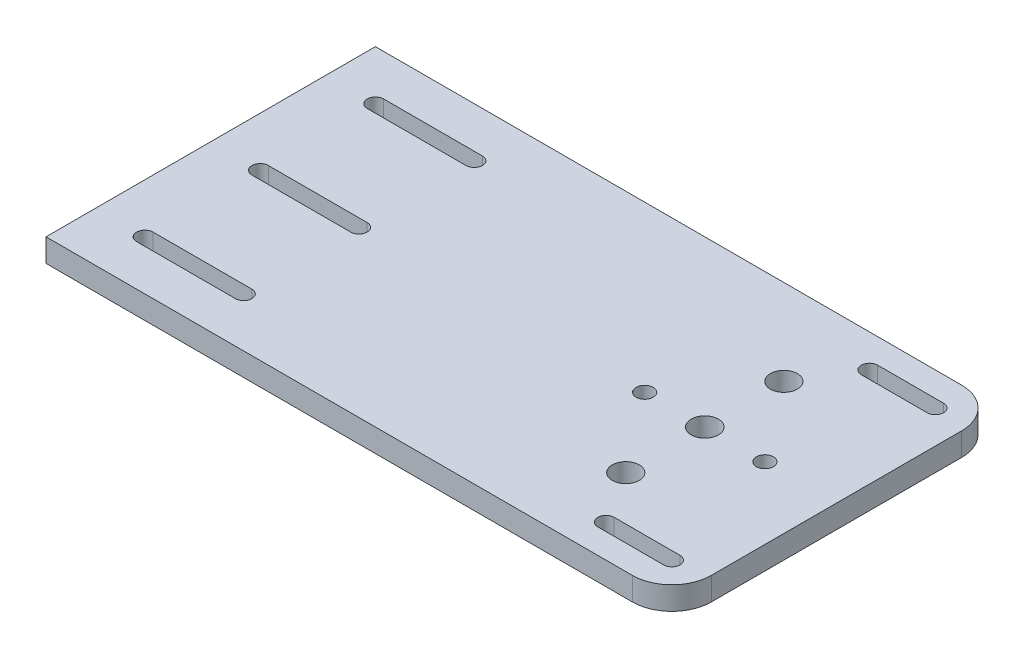
ISO-10303-21;
HEADER;
FILE_DESCRIPTION(('STEP AP214'),'2;1');
FILE_NAME('part.step','',(''),(''),'','','');
FILE_SCHEMA(('AUTOMOTIVE_DESIGN { 1 0 10303 214 1 1 1 1 }'));
ENDSEC;
DATA;
#1=APPLICATION_CONTEXT('core data for automotive mechanical design processes');
#2=APPLICATION_PROTOCOL_DEFINITION('international standard','automotive_design',2000,#1);
#3=PRODUCT_CONTEXT('',#1,'mechanical');
#4=PRODUCT('Part','Part','',(#3));
#5=PRODUCT_RELATED_PRODUCT_CATEGORY('part','',(#4));
#6=PRODUCT_DEFINITION_FORMATION('','',#4);
#7=PRODUCT_DEFINITION_CONTEXT('part definition',#1,'design');
#8=PRODUCT_DEFINITION('design','',#6,#7);
#9=PRODUCT_DEFINITION_SHAPE('','',#8);
#10=(LENGTH_UNIT() NAMED_UNIT(*) SI_UNIT(.MILLI.,.METRE.));
#11=(NAMED_UNIT(*) PLANE_ANGLE_UNIT() SI_UNIT($,.RADIAN.));
#12=(NAMED_UNIT(*) SI_UNIT($,.STERADIAN.) SOLID_ANGLE_UNIT());
#13=UNCERTAINTY_MEASURE_WITH_UNIT(LENGTH_MEASURE(1.E-05),#10,'distance_accuracy_value','');
#14=(GEOMETRIC_REPRESENTATION_CONTEXT(3) GLOBAL_UNCERTAINTY_ASSIGNED_CONTEXT((#13)) GLOBAL_UNIT_ASSIGNED_CONTEXT((#10,
#11,#12)) REPRESENTATION_CONTEXT('',''));
#15=CARTESIAN_POINT('',(0.,0.,0.));
#16=DIRECTION('',(0.,0.,1.));
#17=DIRECTION('',(1.,0.,0.));
#18=AXIS2_PLACEMENT_3D('',#15,#16,#17);
#19=CARTESIAN_POINT('',(0.,7.,-92.5));
#20=DIRECTION('',(0.,0.,-1.));
#21=DIRECTION('',(-1.,0.,0.));
#22=AXIS2_PLACEMENT_3D('',#19,#20,#21);
#23=PLANE('',#22);
#24=DIRECTION('',(1.,0.,0.));
#25=VECTOR('',#24,1.);
#26=CARTESIAN_POINT('',(0.,0.,-92.5));
#27=LINE('',#26,#25);
#28=CARTESIAN_POINT('',(160.,0.,-92.5));
#29=VERTEX_POINT('',#28);
#30=CARTESIAN_POINT('',(180.,0.,-92.5));
#31=VERTEX_POINT('',#30);
#32=EDGE_CURVE('E450',#29,#31,#27,.T.);
#33=ORIENTED_EDGE('',*,*,#32,.T.);
#34=DIRECTION('',(0.,-1.,0.));
#35=VECTOR('',#34,1.);
#36=CARTESIAN_POINT('',(180.,7.,-92.5));
#37=LINE('',#36,#35);
#38=CARTESIAN_POINT('',(180.,7.,-92.5));
#39=VERTEX_POINT('',#38);
#40=EDGE_CURVE('E475',#39,#31,#37,.T.);
#41=ORIENTED_EDGE('',*,*,#40,.F.);
#42=DIRECTION('',(1.,0.,0.));
#43=VECTOR('',#42,1.);
#44=CARTESIAN_POINT('',(0.,7.,-92.5));
#45=LINE('',#44,#43);
#46=CARTESIAN_POINT('',(160.,7.,-92.5));
#47=VERTEX_POINT('',#46);
#48=EDGE_CURVE('E339',#47,#39,#45,.T.);
#49=ORIENTED_EDGE('',*,*,#48,.F.);
#50=DIRECTION('',(0.,-1.,0.));
#51=VECTOR('',#50,1.);
#52=CARTESIAN_POINT('',(160.,7.,-92.5));
#53=LINE('',#52,#51);
#54=EDGE_CURVE('E464',#47,#29,#53,.T.);
#55=ORIENTED_EDGE('',*,*,#54,.T.);
#56=EDGE_LOOP('',(#33,#41,#49,#55));
#57=FACE_BOUND('',#56,.T.);
#58=ADVANCED_FACE('F47',(#57),#23,.F.);
#59=CARTESIAN_POINT('',(180.,7.,-90.));
#60=DIRECTION('',(0.,-1.,0.));
#61=DIRECTION('',(0.,0.,-1.));
#62=AXIS2_PLACEMENT_3D('',#59,#60,#61);
#63=CYLINDRICAL_SURFACE('',#62,2.49999999999999);
#64=CARTESIAN_POINT('',(180.,0.,-90.));
#65=DIRECTION('',(0.,1.,0.));
#66=DIRECTION('',(0.,0.,1.));
#67=AXIS2_PLACEMENT_3D('',#64,#65,#66);
#68=CIRCLE('',#67,2.49999999999999);
#69=CARTESIAN_POINT('',(180.,0.,-87.5));
#70=VERTEX_POINT('',#69);
#71=EDGE_CURVE('E454',#31,#70,#68,.F.);
#72=ORIENTED_EDGE('',*,*,#71,.T.);
#73=DIRECTION('',(0.,-1.,0.));
#74=VECTOR('',#73,1.);
#75=CARTESIAN_POINT('',(180.,7.,-87.5));
#76=LINE('',#75,#74);
#77=CARTESIAN_POINT('',(180.,7.,-87.5));
#78=VERTEX_POINT('',#77);
#79=EDGE_CURVE('E472',#78,#70,#76,.T.);
#80=ORIENTED_EDGE('',*,*,#79,.F.);
#81=CARTESIAN_POINT('',(180.,7.,-90.));
#82=DIRECTION('',(0.,1.,0.));
#83=DIRECTION('',(0.,0.,1.));
#84=AXIS2_PLACEMENT_3D('',#81,#82,#83);
#85=CIRCLE('',#84,2.49999999999999);
#86=EDGE_CURVE('E343',#39,#78,#85,.F.);
#87=ORIENTED_EDGE('',*,*,#86,.F.);
#88=ORIENTED_EDGE('',*,*,#40,.T.);
#89=EDGE_LOOP('',(#72,#80,#87,#88));
#90=FACE_BOUND('',#89,.T.);
#91=ADVANCED_FACE('F572',(#90),#63,.F.);
#92=CARTESIAN_POINT('',(0.,7.,-87.5));
#93=DIRECTION('',(0.,0.,-1.));
#94=DIRECTION('',(-1.,0.,0.));
#95=AXIS2_PLACEMENT_3D('',#92,#93,#94);
#96=PLANE('',#95);
#97=DIRECTION('',(1.,0.,0.));
#98=VECTOR('',#97,1.);
#99=CARTESIAN_POINT('',(0.,0.,-87.5));
#100=LINE('',#99,#98);
#101=CARTESIAN_POINT('',(160.,0.,-87.5));
#102=VERTEX_POINT('',#101);
#103=EDGE_CURVE('E458',#102,#70,#100,.T.);
#104=ORIENTED_EDGE('',*,*,#103,.F.);
#105=DIRECTION('',(0.,-1.,0.));
#106=VECTOR('',#105,1.);
#107=CARTESIAN_POINT('',(160.,7.,-87.5));
#108=LINE('',#107,#106);
#109=CARTESIAN_POINT('',(160.,7.,-87.5));
#110=VERTEX_POINT('',#109);
#111=EDGE_CURVE('E468',#110,#102,#108,.T.);
#112=ORIENTED_EDGE('',*,*,#111,.F.);
#113=DIRECTION('',(1.,0.,0.));
#114=VECTOR('',#113,1.);
#115=CARTESIAN_POINT('',(0.,7.,-87.5));
#116=LINE('',#115,#114);
#117=EDGE_CURVE('E346',#110,#78,#116,.T.);
#118=ORIENTED_EDGE('',*,*,#117,.T.);
#119=ORIENTED_EDGE('',*,*,#79,.T.);
#120=EDGE_LOOP('',(#104,#112,#118,#119));
#121=FACE_BOUND('',#120,.T.);
#122=ADVANCED_FACE('F578',(#121),#96,.T.);
#123=CARTESIAN_POINT('',(45.,7.,-15.));
#124=DIRECTION('',(0.,-1.,0.));
#125=DIRECTION('',(0.,0.,-1.));
#126=AXIS2_PLACEMENT_3D('',#123,#124,#125);
#127=CYLINDRICAL_SURFACE('',#126,2.50000000000002);
#128=CARTESIAN_POINT('',(45.,0.,-15.));
#129=DIRECTION('',(0.,1.,0.));
#130=DIRECTION('',(0.,0.,1.));
#131=AXIS2_PLACEMENT_3D('',#128,#129,#130);
#132=CIRCLE('',#131,2.50000000000002);
#133=CARTESIAN_POINT('',(45.,0.,-12.5));
#134=VERTEX_POINT('',#133);
#135=CARTESIAN_POINT('',(45.,0.,-17.5));
#136=VERTEX_POINT('',#135);
#137=EDGE_CURVE('E430',#134,#136,#132,.T.);
#138=ORIENTED_EDGE('',*,*,#137,.F.);
#139=DIRECTION('',(0.,-1.,0.));
#140=VECTOR('',#139,1.);
#141=CARTESIAN_POINT('',(45.,7.,-12.5));
#142=LINE('',#141,#140);
#143=CARTESIAN_POINT('',(45.,7.,-12.5));
#144=VERTEX_POINT('',#143);
#145=EDGE_CURVE('E469',#144,#134,#142,.T.);
#146=ORIENTED_EDGE('',*,*,#145,.F.);
#147=CARTESIAN_POINT('',(45.,7.,-15.));
#148=DIRECTION('',(0.,1.,0.));
#149=DIRECTION('',(0.,0.,1.));
#150=AXIS2_PLACEMENT_3D('',#147,#148,#149);
#151=CIRCLE('',#150,2.50000000000002);
#152=CARTESIAN_POINT('',(45.,7.,-17.5));
#153=VERTEX_POINT('',#152);
#154=EDGE_CURVE('E320',#144,#153,#151,.T.);
#155=ORIENTED_EDGE('',*,*,#154,.T.);
#156=DIRECTION('',(0.,-1.,0.));
#157=VECTOR('',#156,1.);
#158=CARTESIAN_POINT('',(45.,7.,-17.5));
#159=LINE('',#158,#157);
#160=EDGE_CURVE('E480',#153,#136,#159,.T.);
#161=ORIENTED_EDGE('',*,*,#160,.T.);
#162=EDGE_LOOP('',(#138,#146,#155,#161));
#163=FACE_BOUND('',#162,.T.);
#164=ADVANCED_FACE('F601',(#163),#127,.F.);
#165=CARTESIAN_POINT('',(0.,7.,-12.5));
#166=DIRECTION('',(0.,0.,-1.));
#167=DIRECTION('',(-1.,0.,0.));
#168=AXIS2_PLACEMENT_3D('',#165,#166,#167);
#169=PLANE('',#168);
#170=DIRECTION('',(1.,0.,0.));
#171=VECTOR('',#170,1.);
#172=CARTESIAN_POINT('',(0.,0.,-12.5));
#173=LINE('',#172,#171);
#174=CARTESIAN_POINT('',(15.,0.,-12.5));
#175=VERTEX_POINT('',#174);
#176=EDGE_CURVE('E434',#175,#134,#173,.T.);
#177=ORIENTED_EDGE('',*,*,#176,.F.);
#178=DIRECTION('',(0.,-1.,0.));
#179=VECTOR('',#178,1.);
#180=CARTESIAN_POINT('',(15.,7.,-12.5));
#181=LINE('',#180,#179);
#182=CARTESIAN_POINT('',(15.,7.,-12.5));
#183=VERTEX_POINT('',#182);
#184=EDGE_CURVE('E487',#183,#175,#181,.T.);
#185=ORIENTED_EDGE('',*,*,#184,.F.);
#186=DIRECTION('',(1.,0.,0.));
#187=VECTOR('',#186,1.);
#188=CARTESIAN_POINT('',(0.,7.,-12.5));
#189=LINE('',#188,#187);
#190=EDGE_CURVE('E324',#183,#144,#189,.T.);
#191=ORIENTED_EDGE('',*,*,#190,.T.);
#192=ORIENTED_EDGE('',*,*,#145,.T.);
#193=EDGE_LOOP('',(#177,#185,#191,#192));
#194=FACE_BOUND('',#193,.T.);
#195=ADVANCED_FACE('F597',(#194),#169,.T.);
#196=CARTESIAN_POINT('',(15.,7.,-15.));
#197=DIRECTION('',(0.,-1.,0.));
#198=DIRECTION('',(0.,0.,-1.));
#199=AXIS2_PLACEMENT_3D('',#196,#197,#198);
#200=CYLINDRICAL_SURFACE('',#199,2.50000000000001);
#201=CARTESIAN_POINT('',(15.,0.,-15.));
#202=DIRECTION('',(0.,1.,0.));
#203=DIRECTION('',(0.,0.,1.));
#204=AXIS2_PLACEMENT_3D('',#201,#202,#203);
#205=CIRCLE('',#204,2.50000000000001);
#206=CARTESIAN_POINT('',(15.,0.,-17.5));
#207=VERTEX_POINT('',#206);
#208=EDGE_CURVE('E438',#207,#175,#205,.T.);
#209=ORIENTED_EDGE('',*,*,#208,.F.);
#210=DIRECTION('',(0.,-1.,0.));
#211=VECTOR('',#210,1.);
#212=CARTESIAN_POINT('',(15.,7.,-17.5));
#213=LINE('',#212,#211);
#214=CARTESIAN_POINT('',(15.,7.,-17.5));
#215=VERTEX_POINT('',#214);
#216=EDGE_CURVE('E483',#215,#207,#213,.T.);
#217=ORIENTED_EDGE('',*,*,#216,.F.);
#218=CARTESIAN_POINT('',(15.,7.,-15.));
#219=DIRECTION('',(0.,1.,0.));
#220=DIRECTION('',(0.,0.,1.));
#221=AXIS2_PLACEMENT_3D('',#218,#219,#220);
#222=CIRCLE('',#221,2.50000000000001);
#223=EDGE_CURVE('E328',#215,#183,#222,.T.);
#224=ORIENTED_EDGE('',*,*,#223,.T.);
#225=ORIENTED_EDGE('',*,*,#184,.T.);
#226=EDGE_LOOP('',(#209,#217,#224,#225));
#227=FACE_BOUND('',#226,.T.);
#228=ADVANCED_FACE('F593',(#227),#200,.F.);
#229=CARTESIAN_POINT('',(45.,7.,-50.));
#230=DIRECTION('',(0.,-1.,0.));
#231=DIRECTION('',(0.,0.,-1.));
#232=AXIS2_PLACEMENT_3D('',#229,#230,#231);
#233=CYLINDRICAL_SURFACE('',#232,2.5);
#234=CARTESIAN_POINT('',(45.,0.,-50.));
#235=DIRECTION('',(0.,1.,0.));
#236=DIRECTION('',(0.,0.,1.));
#237=AXIS2_PLACEMENT_3D('',#234,#235,#236);
#238=CIRCLE('',#237,2.5);
#239=CARTESIAN_POINT('',(45.,0.,-47.5));
#240=VERTEX_POINT('',#239);
#241=CARTESIAN_POINT('',(45.,0.,-52.5));
#242=VERTEX_POINT('',#241);
#243=EDGE_CURVE('E414',#240,#242,#238,.T.);
#244=ORIENTED_EDGE('',*,*,#243,.F.);
#245=DIRECTION('',(0.,-1.,0.));
#246=VECTOR('',#245,1.);
#247=CARTESIAN_POINT('',(45.,7.,-47.5));
#248=LINE('',#247,#246);
#249=CARTESIAN_POINT('',(45.,7.,-47.5));
#250=VERTEX_POINT('',#249);
#251=EDGE_CURVE('E484',#250,#240,#248,.T.);
#252=ORIENTED_EDGE('',*,*,#251,.F.);
#253=CARTESIAN_POINT('',(45.,7.,-50.));
#254=DIRECTION('',(0.,1.,0.));
#255=DIRECTION('',(0.,0.,1.));
#256=AXIS2_PLACEMENT_3D('',#253,#254,#255);
#257=CIRCLE('',#256,2.5);
#258=CARTESIAN_POINT('',(45.,7.,-52.5));
#259=VERTEX_POINT('',#258);
#260=EDGE_CURVE('E305',#250,#259,#257,.T.);
#261=ORIENTED_EDGE('',*,*,#260,.T.);
#262=DIRECTION('',(0.,-1.,0.));
#263=VECTOR('',#262,1.);
#264=CARTESIAN_POINT('',(45.,7.,-52.5));
#265=LINE('',#264,#263);
#266=EDGE_CURVE('E492',#259,#242,#265,.T.);
#267=ORIENTED_EDGE('',*,*,#266,.T.);
#268=EDGE_LOOP('',(#244,#252,#261,#267));
#269=FACE_BOUND('',#268,.T.);
#270=ADVANCED_FACE('F596',(#269),#233,.F.);
#271=CARTESIAN_POINT('',(0.,7.,-47.5));
#272=DIRECTION('',(0.,0.,-1.));
#273=DIRECTION('',(-1.,0.,0.));
#274=AXIS2_PLACEMENT_3D('',#271,#272,#273);
#275=PLANE('',#274);
#276=DIRECTION('',(1.,0.,0.));
#277=VECTOR('',#276,1.);
#278=CARTESIAN_POINT('',(0.,0.,-47.5));
#279=LINE('',#278,#277);
#280=CARTESIAN_POINT('',(15.,0.,-47.5));
#281=VERTEX_POINT('',#280);
#282=EDGE_CURVE('E418',#281,#240,#279,.T.);
#283=ORIENTED_EDGE('',*,*,#282,.F.);
#284=DIRECTION('',(0.,-1.,0.));
#285=VECTOR('',#284,1.);
#286=CARTESIAN_POINT('',(15.,7.,-47.5));
#287=LINE('',#286,#285);
#288=CARTESIAN_POINT('',(15.,7.,-47.5));
#289=VERTEX_POINT('',#288);
#290=EDGE_CURVE('E499',#289,#281,#287,.T.);
#291=ORIENTED_EDGE('',*,*,#290,.F.);
#292=DIRECTION('',(1.,0.,0.));
#293=VECTOR('',#292,1.);
#294=CARTESIAN_POINT('',(0.,7.,-47.5));
#295=LINE('',#294,#293);
#296=EDGE_CURVE('E309',#289,#250,#295,.T.);
#297=ORIENTED_EDGE('',*,*,#296,.T.);
#298=ORIENTED_EDGE('',*,*,#251,.T.);
#299=EDGE_LOOP('',(#283,#291,#297,#298));
#300=FACE_BOUND('',#299,.T.);
#301=ADVANCED_FACE('F614',(#300),#275,.T.);
#302=CARTESIAN_POINT('',(15.,7.,-50.));
#303=DIRECTION('',(0.,-1.,0.));
#304=DIRECTION('',(0.,0.,-1.));
#305=AXIS2_PLACEMENT_3D('',#302,#303,#304);
#306=CYLINDRICAL_SURFACE('',#305,2.5);
#307=CARTESIAN_POINT('',(15.,0.,-50.));
#308=DIRECTION('',(0.,1.,0.));
#309=DIRECTION('',(0.,0.,1.));
#310=AXIS2_PLACEMENT_3D('',#307,#308,#309);
#311=CIRCLE('',#310,2.5);
#312=CARTESIAN_POINT('',(15.,0.,-52.5));
#313=VERTEX_POINT('',#312);
#314=EDGE_CURVE('E422',#313,#281,#311,.T.);
#315=ORIENTED_EDGE('',*,*,#314,.F.);
#316=DIRECTION('',(0.,-1.,0.));
#317=VECTOR('',#316,1.);
#318=CARTESIAN_POINT('',(15.,7.,-52.5));
#319=LINE('',#318,#317);
#320=CARTESIAN_POINT('',(15.,7.,-52.5));
#321=VERTEX_POINT('',#320);
#322=EDGE_CURVE('E495',#321,#313,#319,.T.);
#323=ORIENTED_EDGE('',*,*,#322,.F.);
#324=CARTESIAN_POINT('',(15.,7.,-50.));
#325=DIRECTION('',(0.,1.,0.));
#326=DIRECTION('',(0.,0.,1.));
#327=AXIS2_PLACEMENT_3D('',#324,#325,#326);
#328=CIRCLE('',#327,2.5);
#329=EDGE_CURVE('E313',#321,#289,#328,.T.);
#330=ORIENTED_EDGE('',*,*,#329,.T.);
#331=ORIENTED_EDGE('',*,*,#290,.T.);
#332=EDGE_LOOP('',(#315,#323,#330,#331));
#333=FACE_BOUND('',#332,.T.);
#334=ADVANCED_FACE('F610',(#333),#306,.F.);
#335=CARTESIAN_POINT('',(45.,7.,-85.));
#336=DIRECTION('',(0.,-1.,0.));
#337=DIRECTION('',(0.,0.,-1.));
#338=AXIS2_PLACEMENT_3D('',#335,#336,#337);
#339=CYLINDRICAL_SURFACE('',#338,2.5);
#340=CARTESIAN_POINT('',(45.,0.,-85.));
#341=DIRECTION('',(0.,1.,0.));
#342=DIRECTION('',(0.,0.,1.));
#343=AXIS2_PLACEMENT_3D('',#340,#341,#342);
#344=CIRCLE('',#343,2.5);
#345=CARTESIAN_POINT('',(45.,0.,-82.5));
#346=VERTEX_POINT('',#345);
#347=CARTESIAN_POINT('',(45.,0.,-87.5));
#348=VERTEX_POINT('',#347);
#349=EDGE_CURVE('E398',#346,#348,#344,.T.);
#350=ORIENTED_EDGE('',*,*,#349,.F.);
#351=DIRECTION('',(0.,-1.,0.));
#352=VECTOR('',#351,1.);
#353=CARTESIAN_POINT('',(45.,7.,-82.5));
#354=LINE('',#353,#352);
#355=CARTESIAN_POINT('',(45.,7.,-82.5));
#356=VERTEX_POINT('',#355);
#357=EDGE_CURVE('E496',#356,#346,#354,.T.);
#358=ORIENTED_EDGE('',*,*,#357,.F.);
#359=CARTESIAN_POINT('',(45.,7.,-85.));
#360=DIRECTION('',(0.,1.,0.));
#361=DIRECTION('',(0.,0.,1.));
#362=AXIS2_PLACEMENT_3D('',#359,#360,#361);
#363=CIRCLE('',#362,2.5);
#364=CARTESIAN_POINT('',(45.,7.,-87.5));
#365=VERTEX_POINT('',#364);
#366=EDGE_CURVE('E290',#356,#365,#363,.T.);
#367=ORIENTED_EDGE('',*,*,#366,.T.);
#368=DIRECTION('',(0.,-1.,0.));
#369=VECTOR('',#368,1.);
#370=CARTESIAN_POINT('',(45.,7.,-87.5));
#371=LINE('',#370,#369);
#372=EDGE_CURVE('E504',#365,#348,#371,.T.);
#373=ORIENTED_EDGE('',*,*,#372,.T.);
#374=EDGE_LOOP('',(#350,#358,#367,#373));
#375=FACE_BOUND('',#374,.T.);
#376=ADVANCED_FACE('F613',(#375),#339,.F.);
#377=CARTESIAN_POINT('',(0.,7.,-82.5));
#378=DIRECTION('',(0.,0.,-1.));
#379=DIRECTION('',(-1.,0.,0.));
#380=AXIS2_PLACEMENT_3D('',#377,#378,#379);
#381=PLANE('',#380);
#382=DIRECTION('',(1.,0.,0.));
#383=VECTOR('',#382,1.);
#384=CARTESIAN_POINT('',(0.,0.,-82.5));
#385=LINE('',#384,#383);
#386=CARTESIAN_POINT('',(15.,0.,-82.5));
#387=VERTEX_POINT('',#386);
#388=EDGE_CURVE('E402',#387,#346,#385,.T.);
#389=ORIENTED_EDGE('',*,*,#388,.F.);
#390=DIRECTION('',(0.,-1.,0.));
#391=VECTOR('',#390,1.);
#392=CARTESIAN_POINT('',(15.,7.,-82.5));
#393=LINE('',#392,#391);
#394=CARTESIAN_POINT('',(15.,7.,-82.5));
#395=VERTEX_POINT('',#394);
#396=EDGE_CURVE('E511',#395,#387,#393,.T.);
#397=ORIENTED_EDGE('',*,*,#396,.F.);
#398=DIRECTION('',(1.,0.,0.));
#399=VECTOR('',#398,1.);
#400=CARTESIAN_POINT('',(0.,7.,-82.5));
#401=LINE('',#400,#399);
#402=EDGE_CURVE('E294',#395,#356,#401,.T.);
#403=ORIENTED_EDGE('',*,*,#402,.T.);
#404=ORIENTED_EDGE('',*,*,#357,.T.);
#405=EDGE_LOOP('',(#389,#397,#403,#404));
#406=FACE_BOUND('',#405,.T.);
#407=ADVANCED_FACE('F628',(#406),#381,.T.);
#408=CARTESIAN_POINT('',(15.,7.,-85.));
#409=DIRECTION('',(0.,-1.,0.));
#410=DIRECTION('',(0.,0.,-1.));
#411=AXIS2_PLACEMENT_3D('',#408,#409,#410);
#412=CYLINDRICAL_SURFACE('',#411,2.50000000000002);
#413=CARTESIAN_POINT('',(15.,0.,-85.));
#414=DIRECTION('',(0.,1.,0.));
#415=DIRECTION('',(0.,0.,1.));
#416=AXIS2_PLACEMENT_3D('',#413,#414,#415);
#417=CIRCLE('',#416,2.50000000000002);
#418=CARTESIAN_POINT('',(15.,0.,-87.5));
#419=VERTEX_POINT('',#418);
#420=EDGE_CURVE('E406',#419,#387,#417,.T.);
#421=ORIENTED_EDGE('',*,*,#420,.F.);
#422=DIRECTION('',(0.,-1.,0.));
#423=VECTOR('',#422,1.);
#424=CARTESIAN_POINT('',(15.,7.,-87.5));
#425=LINE('',#424,#423);
#426=CARTESIAN_POINT('',(15.,7.,-87.5));
#427=VERTEX_POINT('',#426);
#428=EDGE_CURVE('E507',#427,#419,#425,.T.);
#429=ORIENTED_EDGE('',*,*,#428,.F.);
#430=CARTESIAN_POINT('',(15.,7.,-85.));
#431=DIRECTION('',(0.,1.,0.));
#432=DIRECTION('',(0.,0.,1.));
#433=AXIS2_PLACEMENT_3D('',#430,#431,#432);
#434=CIRCLE('',#433,2.50000000000002);
#435=EDGE_CURVE('E298',#427,#395,#434,.T.);
#436=ORIENTED_EDGE('',*,*,#435,.T.);
#437=ORIENTED_EDGE('',*,*,#396,.T.);
#438=EDGE_LOOP('',(#421,#429,#436,#437));
#439=FACE_BOUND('',#438,.T.);
#440=ADVANCED_FACE('F625',(#439),#412,.F.);
#441=CARTESIAN_POINT('',(0.,7.,0.));
#442=DIRECTION('',(0.,0.,-1.));
#443=DIRECTION('',(-1.,0.,0.));
#444=AXIS2_PLACEMENT_3D('',#441,#442,#443);
#445=PLANE('',#444);
#446=DIRECTION('',(1.,0.,0.));
#447=VECTOR('',#446,1.);
#448=CARTESIAN_POINT('',(0.,0.,0.));
#449=LINE('',#448,#447);
#450=CARTESIAN_POINT('',(0.,0.,0.));
#451=VERTEX_POINT('',#450);
#452=CARTESIAN_POINT('',(178.,0.,0.));
#453=VERTEX_POINT('',#452);
#454=EDGE_CURVE('E383',#451,#453,#449,.T.);
#455=ORIENTED_EDGE('',*,*,#454,.T.);
#456=DIRECTION('',(0.,-1.,0.));
#457=VECTOR('',#456,1.);
#458=CARTESIAN_POINT('',(178.,7.,0.));
#459=LINE('',#458,#457);
#460=CARTESIAN_POINT('',(178.,7.,0.));
#461=VERTEX_POINT('',#460);
#462=EDGE_CURVE('E71',#453,#461,#459,.F.);
#463=ORIENTED_EDGE('',*,*,#462,.T.);
#464=DIRECTION('',(1.,0.,0.));
#465=VECTOR('',#464,1.);
#466=CARTESIAN_POINT('',(0.,7.,0.));
#467=LINE('',#466,#465);
#468=CARTESIAN_POINT('',(0.,7.,0.));
#469=VERTEX_POINT('',#468);
#470=EDGE_CURVE('E277',#469,#461,#467,.T.);
#471=ORIENTED_EDGE('',*,*,#470,.F.);
#472=DIRECTION('',(0.,-1.,0.));
#473=VECTOR('',#472,1.);
#474=CARTESIAN_POINT('',(0.,7.,0.));
#475=LINE('',#474,#473);
#476=EDGE_CURVE('E236',#469,#451,#475,.T.);
#477=ORIENTED_EDGE('',*,*,#476,.T.);
#478=EDGE_LOOP('',(#455,#463,#471,#477));
#479=FACE_BOUND('',#478,.T.);
#480=ADVANCED_FACE('F559',(#479),#445,.F.);
#481=CARTESIAN_POINT('',(190.,7.,0.));
#482=DIRECTION('',(-1.,0.,0.));
#483=DIRECTION('',(0.,0.,1.));
#484=AXIS2_PLACEMENT_3D('',#481,#482,#483);
#485=PLANE('',#484);
#486=DIRECTION('',(0.,0.,-1.));
#487=VECTOR('',#486,1.);
#488=CARTESIAN_POINT('',(190.,7.,0.));
#489=LINE('',#488,#487);
#490=CARTESIAN_POINT('',(190.,7.,-12.));
#491=VERTEX_POINT('',#490);
#492=CARTESIAN_POINT('',(190.,7.,-88.));
#493=VERTEX_POINT('',#492);
#494=EDGE_CURVE('E280',#491,#493,#489,.T.);
#495=ORIENTED_EDGE('',*,*,#494,.F.);
#496=DIRECTION('',(0.,-1.,0.));
#497=VECTOR('',#496,1.);
#498=CARTESIAN_POINT('',(190.,7.,-12.));
#499=LINE('',#498,#497);
#500=CARTESIAN_POINT('',(190.,0.,-12.));
#501=VERTEX_POINT('',#500);
#502=EDGE_CURVE('E529',#491,#501,#499,.T.);
#503=ORIENTED_EDGE('',*,*,#502,.T.);
#504=DIRECTION('',(0.,0.,-1.));
#505=VECTOR('',#504,1.);
#506=CARTESIAN_POINT('',(190.,0.,0.));
#507=LINE('',#506,#505);
#508=CARTESIAN_POINT('',(190.,0.,-88.));
#509=VERTEX_POINT('',#508);
#510=EDGE_CURVE('E386',#501,#509,#507,.T.);
#511=ORIENTED_EDGE('',*,*,#510,.T.);
#512=DIRECTION('',(0.,-1.,0.));
#513=VECTOR('',#512,1.);
#514=CARTESIAN_POINT('',(190.,7.,-88.));
#515=LINE('',#514,#513);
#516=EDGE_CURVE('E479',#509,#493,#515,.F.);
#517=ORIENTED_EDGE('',*,*,#516,.T.);
#518=EDGE_LOOP('',(#495,#503,#511,#517));
#519=FACE_BOUND('',#518,.T.);
#520=ADVANCED_FACE('F550',(#519),#485,.F.);
#521=CARTESIAN_POINT('',(0.,7.,-100.));
#522=DIRECTION('',(0.,0.,-1.));
#523=DIRECTION('',(-1.,0.,0.));
#524=AXIS2_PLACEMENT_3D('',#521,#522,#523);
#525=PLANE('',#524);
#526=DIRECTION('',(1.,0.,0.));
#527=VECTOR('',#526,1.);
#528=CARTESIAN_POINT('',(0.,7.,-100.));
#529=LINE('',#528,#527);
#530=CARTESIAN_POINT('',(0.,7.,-100.));
#531=VERTEX_POINT('',#530);
#532=CARTESIAN_POINT('',(178.,7.,-100.));
#533=VERTEX_POINT('',#532);
#534=EDGE_CURVE('E283',#531,#533,#529,.T.);
#535=ORIENTED_EDGE('',*,*,#534,.T.);
#536=DIRECTION('',(0.,-1.,0.));
#537=VECTOR('',#536,1.);
#538=CARTESIAN_POINT('',(178.,0.,-100.));
#539=LINE('',#538,#537);
#540=CARTESIAN_POINT('',(178.,0.,-100.));
#541=VERTEX_POINT('',#540);
#542=EDGE_CURVE('E11',#533,#541,#539,.T.);
#543=ORIENTED_EDGE('',*,*,#542,.T.);
#544=DIRECTION('',(1.,0.,0.));
#545=VECTOR('',#544,1.);
#546=CARTESIAN_POINT('',(0.,0.,-100.));
#547=LINE('',#546,#545);
#548=CARTESIAN_POINT('',(0.,0.,-100.));
#549=VERTEX_POINT('',#548);
#550=EDGE_CURVE('E390',#549,#541,#547,.T.);
#551=ORIENTED_EDGE('',*,*,#550,.F.);
#552=DIRECTION('',(0.,-1.,0.));
#553=VECTOR('',#552,1.);
#554=CARTESIAN_POINT('',(0.,7.,-100.));
#555=LINE('',#554,#553);
#556=EDGE_CURVE('E508',#531,#549,#555,.T.);
#557=ORIENTED_EDGE('',*,*,#556,.F.);
#558=EDGE_LOOP('',(#535,#543,#551,#557));
#559=FACE_BOUND('',#558,.T.);
#560=ADVANCED_FACE('F564',(#559),#525,.T.);
#561=CARTESIAN_POINT('',(180.,7.,-9.99999999999999));
#562=DIRECTION('',(0.,-1.,0.));
#563=DIRECTION('',(0.,0.,-1.));
#564=AXIS2_PLACEMENT_3D('',#561,#562,#563);
#565=CYLINDRICAL_SURFACE('',#564,2.49999999999999);
#566=CARTESIAN_POINT('',(180.,0.,-9.99999999999999));
#567=DIRECTION('',(0.,1.,0.));
#568=DIRECTION('',(0.,0.,1.));
#569=AXIS2_PLACEMENT_3D('',#566,#567,#568);
#570=CIRCLE('',#569,2.49999999999999);
#571=CARTESIAN_POINT('',(180.,0.,-7.5));
#572=VERTEX_POINT('',#571);
#573=CARTESIAN_POINT('',(180.,0.,-12.5));
#574=VERTEX_POINT('',#573);
#575=EDGE_CURVE('E230',#572,#574,#570,.T.);
#576=ORIENTED_EDGE('',*,*,#575,.F.);
#577=DIRECTION('',(0.,-1.,0.));
#578=VECTOR('',#577,1.);
#579=CARTESIAN_POINT('',(180.,7.,-7.5));
#580=LINE('',#579,#578);
#581=CARTESIAN_POINT('',(180.,7.,-7.5));
#582=VERTEX_POINT('',#581);
#583=EDGE_CURVE('E225',#582,#572,#580,.T.);
#584=ORIENTED_EDGE('',*,*,#583,.F.);
#585=CARTESIAN_POINT('',(180.,7.,-9.99999999999999));
#586=DIRECTION('',(0.,1.,0.));
#587=DIRECTION('',(0.,0.,1.));
#588=AXIS2_PLACEMENT_3D('',#585,#586,#587);
#589=CIRCLE('',#588,2.49999999999999);
#590=CARTESIAN_POINT('',(180.,7.,-12.5));
#591=VERTEX_POINT('',#590);
#592=EDGE_CURVE('E228',#582,#591,#589,.T.);
#593=ORIENTED_EDGE('',*,*,#592,.T.);
#594=DIRECTION('',(0.,-1.,0.));
#595=VECTOR('',#594,1.);
#596=CARTESIAN_POINT('',(180.,7.,-12.5));
#597=LINE('',#596,#595);
#598=EDGE_CURVE('E353',#591,#574,#597,.T.);
#599=ORIENTED_EDGE('',*,*,#598,.T.);
#600=EDGE_LOOP('',(#576,#584,#593,#599));
#601=FACE_BOUND('',#600,.T.);
#602=ADVANCED_FACE('F227',(#601),#565,.F.);
#603=CARTESIAN_POINT('',(0.,7.,-7.5));
#604=DIRECTION('',(0.,0.,-1.));
#605=DIRECTION('',(-1.,0.,0.));
#606=AXIS2_PLACEMENT_3D('',#603,#604,#605);
#607=PLANE('',#606);
#608=DIRECTION('',(1.,0.,0.));
#609=VECTOR('',#608,1.);
#610=CARTESIAN_POINT('',(0.,0.,-7.5));
#611=LINE('',#610,#609);
#612=CARTESIAN_POINT('',(160.,0.,-7.5));
#613=VERTEX_POINT('',#612);
#614=EDGE_CURVE('E356',#613,#572,#611,.T.);
#615=ORIENTED_EDGE('',*,*,#614,.F.);
#616=DIRECTION('',(0.,-1.,0.));
#617=VECTOR('',#616,1.);
#618=CARTESIAN_POINT('',(160.,7.,-7.5));
#619=LINE('',#618,#617);
#620=CARTESIAN_POINT('',(160.,7.,-7.5));
#621=VERTEX_POINT('',#620);
#622=EDGE_CURVE('E237',#621,#613,#619,.T.);
#623=ORIENTED_EDGE('',*,*,#622,.F.);
#624=DIRECTION('',(1.,0.,0.));
#625=VECTOR('',#624,1.);
#626=CARTESIAN_POINT('',(0.,7.,-7.5));
#627=LINE('',#626,#625);
#628=EDGE_CURVE('E244',#621,#582,#627,.T.);
#629=ORIENTED_EDGE('',*,*,#628,.T.);
#630=ORIENTED_EDGE('',*,*,#583,.T.);
#631=EDGE_LOOP('',(#615,#623,#629,#630));
#632=FACE_BOUND('',#631,.T.);
#633=ADVANCED_FACE('F252',(#632),#607,.T.);
#634=CARTESIAN_POINT('',(160.,7.,-9.99999999999999));
#635=DIRECTION('',(0.,-1.,0.));
#636=DIRECTION('',(0.,0.,-1.));
#637=AXIS2_PLACEMENT_3D('',#634,#635,#636);
#638=CYLINDRICAL_SURFACE('',#637,2.49999999999999);
#639=CARTESIAN_POINT('',(160.,0.,-9.99999999999999));
#640=DIRECTION('',(0.,1.,0.));
#641=DIRECTION('',(0.,0.,1.));
#642=AXIS2_PLACEMENT_3D('',#639,#640,#641);
#643=CIRCLE('',#642,2.49999999999999);
#644=CARTESIAN_POINT('',(160.,0.,-12.5));
#645=VERTEX_POINT('',#644);
#646=EDGE_CURVE('E359',#645,#613,#643,.T.);
#647=ORIENTED_EDGE('',*,*,#646,.F.);
#648=DIRECTION('',(0.,-1.,0.));
#649=VECTOR('',#648,1.);
#650=CARTESIAN_POINT('',(160.,7.,-12.5));
#651=LINE('',#650,#649);
#652=CARTESIAN_POINT('',(160.,7.,-12.5));
#653=VERTEX_POINT('',#652);
#654=EDGE_CURVE('E522',#653,#645,#651,.T.);
#655=ORIENTED_EDGE('',*,*,#654,.F.);
#656=CARTESIAN_POINT('',(160.,7.,-9.99999999999999));
#657=DIRECTION('',(0.,1.,0.));
#658=DIRECTION('',(0.,0.,1.));
#659=AXIS2_PLACEMENT_3D('',#656,#657,#658);
#660=CIRCLE('',#659,2.49999999999999);
#661=EDGE_CURVE('E254',#653,#621,#660,.T.);
#662=ORIENTED_EDGE('',*,*,#661,.T.);
#663=ORIENTED_EDGE('',*,*,#622,.T.);
#664=EDGE_LOOP('',(#647,#655,#662,#663));
#665=FACE_BOUND('',#664,.T.);
#666=ADVANCED_FACE('F587',(#665),#638,.F.);
#667=CARTESIAN_POINT('',(150.,7.,-26.));
#668=DIRECTION('',(0.,-1.,0.));
#669=DIRECTION('',(0.,0.,-1.));
#670=AXIS2_PLACEMENT_3D('',#667,#668,#669);
#671=CYLINDRICAL_SURFACE('',#670,4.09999999999999);
#672=CARTESIAN_POINT('',(150.,7.,-26.));
#673=DIRECTION('',(0.,1.,0.));
#674=DIRECTION('',(0.,0.,1.));
#675=AXIS2_PLACEMENT_3D('',#672,#673,#674);
#676=CIRCLE('',#675,4.09999999999999);
#677=CARTESIAN_POINT('',(150.,7.,-21.9));
#678=VERTEX_POINT('',#677);
#679=EDGE_CURVE('E335',#678,#678,#676,.F.);
#680=ORIENTED_EDGE('',*,*,#679,.F.);
#681=EDGE_LOOP('',(#680));
#682=FACE_BOUND('',#681,.T.);
#683=CARTESIAN_POINT('',(150.,0.,-26.));
#684=DIRECTION('',(0.,1.,0.));
#685=DIRECTION('',(0.,0.,1.));
#686=AXIS2_PLACEMENT_3D('',#683,#684,#685);
#687=CIRCLE('',#686,4.09999999999999);
#688=CARTESIAN_POINT('',(150.,0.,-21.9));
#689=VERTEX_POINT('',#688);
#690=EDGE_CURVE('E446',#689,#689,#687,.F.);
#691=ORIENTED_EDGE('',*,*,#690,.T.);
#692=EDGE_LOOP('',(#691));
#693=FACE_BOUND('',#692,.T.);
#694=ADVANCED_FACE('F583',(#682,#693),#671,.F.);
#695=CARTESIAN_POINT('',(0.,7.,-17.5));
#696=DIRECTION('',(0.,0.,-1.));
#697=DIRECTION('',(-1.,0.,0.));
#698=AXIS2_PLACEMENT_3D('',#695,#696,#697);
#699=PLANE('',#698);
#700=DIRECTION('',(1.,0.,0.));
#701=VECTOR('',#700,1.);
#702=CARTESIAN_POINT('',(0.,0.,-17.5));
#703=LINE('',#702,#701);
#704=EDGE_CURVE('E442',#207,#136,#703,.T.);
#705=ORIENTED_EDGE('',*,*,#704,.T.);
#706=ORIENTED_EDGE('',*,*,#160,.F.);
#707=DIRECTION('',(1.,0.,0.));
#708=VECTOR('',#707,1.);
#709=CARTESIAN_POINT('',(0.,7.,-17.5));
#710=LINE('',#709,#708);
#711=EDGE_CURVE('E332',#215,#153,#710,.T.);
#712=ORIENTED_EDGE('',*,*,#711,.F.);
#713=ORIENTED_EDGE('',*,*,#216,.T.);
#714=EDGE_LOOP('',(#705,#706,#712,#713));
#715=FACE_BOUND('',#714,.T.);
#716=ADVANCED_FACE('F586',(#715),#699,.F.);
#717=CARTESIAN_POINT('',(0.,7.,-52.5));
#718=DIRECTION('',(0.,0.,-1.));
#719=DIRECTION('',(-1.,0.,0.));
#720=AXIS2_PLACEMENT_3D('',#717,#718,#719);
#721=PLANE('',#720);
#722=DIRECTION('',(1.,0.,0.));
#723=VECTOR('',#722,1.);
#724=CARTESIAN_POINT('',(0.,0.,-52.5));
#725=LINE('',#724,#723);
#726=EDGE_CURVE('E426',#313,#242,#725,.T.);
#727=ORIENTED_EDGE('',*,*,#726,.T.);
#728=ORIENTED_EDGE('',*,*,#266,.F.);
#729=DIRECTION('',(1.,0.,0.));
#730=VECTOR('',#729,1.);
#731=CARTESIAN_POINT('',(0.,7.,-52.5));
#732=LINE('',#731,#730);
#733=EDGE_CURVE('E317',#321,#259,#732,.T.);
#734=ORIENTED_EDGE('',*,*,#733,.F.);
#735=ORIENTED_EDGE('',*,*,#322,.T.);
#736=EDGE_LOOP('',(#727,#728,#734,#735));
#737=FACE_BOUND('',#736,.T.);
#738=ADVANCED_FACE('F591',(#737),#721,.F.);
#739=CARTESIAN_POINT('',(0.,7.,-87.5));
#740=DIRECTION('',(0.,0.,-1.));
#741=DIRECTION('',(-1.,0.,0.));
#742=AXIS2_PLACEMENT_3D('',#739,#740,#741);
#743=PLANE('',#742);
#744=DIRECTION('',(1.,0.,0.));
#745=VECTOR('',#744,1.);
#746=CARTESIAN_POINT('',(0.,0.,-87.5));
#747=LINE('',#746,#745);
#748=EDGE_CURVE('E410',#419,#348,#747,.T.);
#749=ORIENTED_EDGE('',*,*,#748,.T.);
#750=ORIENTED_EDGE('',*,*,#372,.F.);
#751=DIRECTION('',(1.,0.,0.));
#752=VECTOR('',#751,1.);
#753=CARTESIAN_POINT('',(0.,7.,-87.5));
#754=LINE('',#753,#752);
#755=EDGE_CURVE('E302',#427,#365,#754,.T.);
#756=ORIENTED_EDGE('',*,*,#755,.F.);
#757=ORIENTED_EDGE('',*,*,#428,.T.);
#758=EDGE_LOOP('',(#749,#750,#756,#757));
#759=FACE_BOUND('',#758,.T.);
#760=ADVANCED_FACE('F608',(#759),#743,.F.);
#761=CARTESIAN_POINT('',(0.,7.,0.));
#762=DIRECTION('',(-1.,0.,0.));
#763=DIRECTION('',(0.,0.,1.));
#764=AXIS2_PLACEMENT_3D('',#761,#762,#763);
#765=PLANE('',#764);
#766=DIRECTION('',(0.,0.,-1.));
#767=VECTOR('',#766,1.);
#768=CARTESIAN_POINT('',(0.,0.,0.));
#769=LINE('',#768,#767);
#770=EDGE_CURVE('E394',#451,#549,#769,.T.);
#771=ORIENTED_EDGE('',*,*,#770,.F.);
#772=ORIENTED_EDGE('',*,*,#476,.F.);
#773=DIRECTION('',(0.,0.,-1.));
#774=VECTOR('',#773,1.);
#775=CARTESIAN_POINT('',(0.,7.,0.));
#776=LINE('',#775,#774);
#777=EDGE_CURVE('E286',#469,#531,#776,.T.);
#778=ORIENTED_EDGE('',*,*,#777,.T.);
#779=ORIENTED_EDGE('',*,*,#556,.T.);
#780=EDGE_LOOP('',(#771,#772,#778,#779));
#781=FACE_BOUND('',#780,.T.);
#782=ADVANCED_FACE('F561',(#781),#765,.T.);
#783=CARTESIAN_POINT('',(150.,7.,-50.));
#784=DIRECTION('',(0.,-1.,0.));
#785=DIRECTION('',(0.,0.,-1.));
#786=AXIS2_PLACEMENT_3D('',#783,#784,#785);
#787=CYLINDRICAL_SURFACE('',#786,4.14999999999998);
#788=CARTESIAN_POINT('',(150.,7.,-50.));
#789=DIRECTION('',(0.,1.,0.));
#790=DIRECTION('',(0.,0.,1.));
#791=AXIS2_PLACEMENT_3D('',#788,#789,#790);
#792=CIRCLE('',#791,4.14999999999998);
#793=CARTESIAN_POINT('',(150.,7.,-45.85));
#794=VERTEX_POINT('',#793);
#795=EDGE_CURVE('E273',#794,#794,#792,.T.);
#796=ORIENTED_EDGE('',*,*,#795,.T.);
#797=EDGE_LOOP('',(#796));
#798=FACE_BOUND('',#797,.T.);
#799=CARTESIAN_POINT('',(150.,0.,-50.));
#800=DIRECTION('',(0.,1.,0.));
#801=DIRECTION('',(0.,0.,1.));
#802=AXIS2_PLACEMENT_3D('',#799,#800,#801);
#803=CIRCLE('',#802,4.14999999999998);
#804=CARTESIAN_POINT('',(150.,0.,-45.85));
#805=VERTEX_POINT('',#804);
#806=EDGE_CURVE('E379',#805,#805,#803,.T.);
#807=ORIENTED_EDGE('',*,*,#806,.F.);
#808=EDGE_LOOP('',(#807));
#809=FACE_BOUND('',#808,.T.);
#810=ADVANCED_FACE('F638',(#798,#809),#787,.F.);
#811=CARTESIAN_POINT('',(150.,7.,-74.));
#812=DIRECTION('',(0.,-1.,0.));
#813=DIRECTION('',(0.,0.,-1.));
#814=AXIS2_PLACEMENT_3D('',#811,#812,#813);
#815=CYLINDRICAL_SURFACE('',#814,4.09999999999998);
#816=CARTESIAN_POINT('',(150.,7.,-74.));
#817=DIRECTION('',(0.,1.,0.));
#818=DIRECTION('',(0.,0.,1.));
#819=AXIS2_PLACEMENT_3D('',#816,#817,#818);
#820=CIRCLE('',#819,4.09999999999998);
#821=CARTESIAN_POINT('',(150.,7.,-69.9));
#822=VERTEX_POINT('',#821);
#823=EDGE_CURVE('E269',#822,#822,#820,.T.);
#824=ORIENTED_EDGE('',*,*,#823,.T.);
#825=EDGE_LOOP('',(#824));
#826=FACE_BOUND('',#825,.T.);
#827=CARTESIAN_POINT('',(150.,0.,-74.));
#828=DIRECTION('',(0.,1.,0.));
#829=DIRECTION('',(0.,0.,1.));
#830=AXIS2_PLACEMENT_3D('',#827,#828,#829);
#831=CIRCLE('',#830,4.09999999999998);
#832=CARTESIAN_POINT('',(150.,0.,-69.9));
#833=VERTEX_POINT('',#832);
#834=EDGE_CURVE('E375',#833,#833,#831,.T.);
#835=ORIENTED_EDGE('',*,*,#834,.F.);
#836=EDGE_LOOP('',(#835));
#837=FACE_BOUND('',#836,.T.);
#838=ADVANCED_FACE('F647',(#826,#837),#815,.F.);
#839=CARTESIAN_POINT('',(131.75,7.,-50.));
#840=DIRECTION('',(0.,-1.,0.));
#841=DIRECTION('',(0.,0.,-1.));
#842=AXIS2_PLACEMENT_3D('',#839,#840,#841);
#843=CYLINDRICAL_SURFACE('',#842,2.59999999999996);
#844=CARTESIAN_POINT('',(131.75,7.,-50.));
#845=DIRECTION('',(0.,1.,0.));
#846=DIRECTION('',(0.,0.,1.));
#847=AXIS2_PLACEMENT_3D('',#844,#845,#846);
#848=CIRCLE('',#847,2.59999999999996);
#849=CARTESIAN_POINT('',(131.75,7.,-47.4));
#850=VERTEX_POINT('',#849);
#851=EDGE_CURVE('E265',#850,#850,#848,.T.);
#852=ORIENTED_EDGE('',*,*,#851,.T.);
#853=EDGE_LOOP('',(#852));
#854=FACE_BOUND('',#853,.T.);
#855=CARTESIAN_POINT('',(131.75,0.,-50.));
#856=DIRECTION('',(0.,1.,0.));
#857=DIRECTION('',(0.,0.,1.));
#858=AXIS2_PLACEMENT_3D('',#855,#856,#857);
#859=CIRCLE('',#858,2.59999999999996);
#860=CARTESIAN_POINT('',(131.75,0.,-47.4));
#861=VERTEX_POINT('',#860);
#862=EDGE_CURVE('E371',#861,#861,#859,.T.);
#863=ORIENTED_EDGE('',*,*,#862,.F.);
#864=EDGE_LOOP('',(#863));
#865=FACE_BOUND('',#864,.T.);
#866=ADVANCED_FACE('F651',(#854,#865),#843,.F.);
#867=CARTESIAN_POINT('',(168.25,7.,-50.));
#868=DIRECTION('',(0.,-1.,0.));
#869=DIRECTION('',(0.,0.,-1.));
#870=AXIS2_PLACEMENT_3D('',#867,#868,#869);
#871=CYLINDRICAL_SURFACE('',#870,2.59999999999999);
#872=CARTESIAN_POINT('',(168.25,7.,-50.));
#873=DIRECTION('',(0.,1.,0.));
#874=DIRECTION('',(0.,0.,1.));
#875=AXIS2_PLACEMENT_3D('',#872,#873,#874);
#876=CIRCLE('',#875,2.59999999999999);
#877=CARTESIAN_POINT('',(168.25,7.,-47.4));
#878=VERTEX_POINT('',#877);
#879=EDGE_CURVE('E261',#878,#878,#876,.F.);
#880=ORIENTED_EDGE('',*,*,#879,.F.);
#881=EDGE_LOOP('',(#880));
#882=FACE_BOUND('',#881,.T.);
#883=CARTESIAN_POINT('',(168.25,0.,-50.));
#884=DIRECTION('',(0.,1.,0.));
#885=DIRECTION('',(0.,0.,1.));
#886=AXIS2_PLACEMENT_3D('',#883,#884,#885);
#887=CIRCLE('',#886,2.59999999999999);
#888=CARTESIAN_POINT('',(168.25,0.,-47.4));
#889=VERTEX_POINT('',#888);
#890=EDGE_CURVE('E367',#889,#889,#887,.F.);
#891=ORIENTED_EDGE('',*,*,#890,.T.);
#892=EDGE_LOOP('',(#891));
#893=FACE_BOUND('',#892,.T.);
#894=ADVANCED_FACE('F655',(#882,#893),#871,.F.);
#895=CARTESIAN_POINT('',(0.,7.,-12.5));
#896=DIRECTION('',(0.,0.,-1.));
#897=DIRECTION('',(-1.,0.,0.));
#898=AXIS2_PLACEMENT_3D('',#895,#896,#897);
#899=PLANE('',#898);
#900=DIRECTION('',(1.,0.,0.));
#901=VECTOR('',#900,1.);
#902=CARTESIAN_POINT('',(0.,0.,-12.5));
#903=LINE('',#902,#901);
#904=EDGE_CURVE('E363',#645,#574,#903,.T.);
#905=ORIENTED_EDGE('',*,*,#904,.T.);
#906=ORIENTED_EDGE('',*,*,#598,.F.);
#907=DIRECTION('',(1.,0.,0.));
#908=VECTOR('',#907,1.);
#909=CARTESIAN_POINT('',(0.,7.,-12.5));
#910=LINE('',#909,#908);
#911=EDGE_CURVE('E247',#653,#591,#910,.T.);
#912=ORIENTED_EDGE('',*,*,#911,.F.);
#913=ORIENTED_EDGE('',*,*,#654,.T.);
#914=EDGE_LOOP('',(#905,#906,#912,#913));
#915=FACE_BOUND('',#914,.T.);
#916=ADVANCED_FACE('F659',(#915),#899,.F.);
#917=CARTESIAN_POINT('',(160.,7.,-90.));
#918=DIRECTION('',(0.,-1.,0.));
#919=DIRECTION('',(0.,0.,-1.));
#920=AXIS2_PLACEMENT_3D('',#917,#918,#919);
#921=CYLINDRICAL_SURFACE('',#920,2.49999999999999);
#922=CARTESIAN_POINT('',(160.,0.,-90.));
#923=DIRECTION('',(0.,1.,0.));
#924=DIRECTION('',(0.,0.,1.));
#925=AXIS2_PLACEMENT_3D('',#922,#923,#924);
#926=CIRCLE('',#925,2.49999999999999);
#927=EDGE_CURVE('E250',#102,#29,#926,.F.);
#928=ORIENTED_EDGE('',*,*,#927,.T.);
#929=ORIENTED_EDGE('',*,*,#54,.F.);
#930=CARTESIAN_POINT('',(160.,7.,-90.));
#931=DIRECTION('',(0.,1.,0.));
#932=DIRECTION('',(0.,0.,1.));
#933=AXIS2_PLACEMENT_3D('',#930,#931,#932);
#934=CIRCLE('',#933,2.49999999999999);
#935=EDGE_CURVE('E350',#110,#47,#934,.F.);
#936=ORIENTED_EDGE('',*,*,#935,.F.);
#937=ORIENTED_EDGE('',*,*,#111,.T.);
#938=EDGE_LOOP('',(#928,#929,#936,#937));
#939=FACE_BOUND('',#938,.T.);
#940=ADVANCED_FACE('F663',(#939),#921,.F.);
#941=CARTESIAN_POINT('',(0.,7.,0.));
#942=DIRECTION('',(0.,1.,0.));
#943=DIRECTION('',(0.,0.,1.));
#944=AXIS2_PLACEMENT_3D('',#941,#942,#943);
#945=PLANE('',#944);
#946=ORIENTED_EDGE('',*,*,#592,.F.);
#947=ORIENTED_EDGE('',*,*,#628,.F.);
#948=ORIENTED_EDGE('',*,*,#661,.F.);
#949=ORIENTED_EDGE('',*,*,#911,.T.);
#950=EDGE_LOOP('',(#946,#947,#948,#949));
#951=FACE_BOUND('',#950,.T.);
#952=ORIENTED_EDGE('',*,*,#879,.T.);
#953=EDGE_LOOP('',(#952));
#954=FACE_BOUND('',#953,.T.);
#955=ORIENTED_EDGE('',*,*,#851,.F.);
#956=EDGE_LOOP('',(#955));
#957=FACE_BOUND('',#956,.T.);
#958=ORIENTED_EDGE('',*,*,#823,.F.);
#959=EDGE_LOOP('',(#958));
#960=FACE_BOUND('',#959,.T.);
#961=ORIENTED_EDGE('',*,*,#795,.F.);
#962=EDGE_LOOP('',(#961));
#963=FACE_BOUND('',#962,.T.);
#964=ORIENTED_EDGE('',*,*,#470,.T.);
#965=CARTESIAN_POINT('',(178.,7.,-12.));
#966=DIRECTION('',(0.,1.,0.));
#967=DIRECTION('',(0.,0.,1.));
#968=AXIS2_PLACEMENT_3D('',#965,#966,#967);
#969=CIRCLE('',#968,12.);
#970=EDGE_CURVE('E56',#461,#491,#969,.T.);
#971=ORIENTED_EDGE('',*,*,#970,.T.);
#972=ORIENTED_EDGE('',*,*,#494,.T.);
#973=CARTESIAN_POINT('',(178.,7.,-88.));
#974=DIRECTION('',(0.,1.,0.));
#975=DIRECTION('',(0.,0.,1.));
#976=AXIS2_PLACEMENT_3D('',#973,#974,#975);
#977=CIRCLE('',#976,12.);
#978=EDGE_CURVE('E63',#493,#533,#977,.T.);
#979=ORIENTED_EDGE('',*,*,#978,.T.);
#980=ORIENTED_EDGE('',*,*,#534,.F.);
#981=ORIENTED_EDGE('',*,*,#777,.F.);
#982=EDGE_LOOP('',(#964,#971,#972,#979,#980,#981));
#983=FACE_BOUND('',#982,.T.);
#984=ORIENTED_EDGE('',*,*,#366,.F.);
#985=ORIENTED_EDGE('',*,*,#402,.F.);
#986=ORIENTED_EDGE('',*,*,#435,.F.);
#987=ORIENTED_EDGE('',*,*,#755,.T.);
#988=EDGE_LOOP('',(#984,#985,#986,#987));
#989=FACE_BOUND('',#988,.T.);
#990=ORIENTED_EDGE('',*,*,#260,.F.);
#991=ORIENTED_EDGE('',*,*,#296,.F.);
#992=ORIENTED_EDGE('',*,*,#329,.F.);
#993=ORIENTED_EDGE('',*,*,#733,.T.);
#994=EDGE_LOOP('',(#990,#991,#992,#993));
#995=FACE_BOUND('',#994,.T.);
#996=ORIENTED_EDGE('',*,*,#154,.F.);
#997=ORIENTED_EDGE('',*,*,#190,.F.);
#998=ORIENTED_EDGE('',*,*,#223,.F.);
#999=ORIENTED_EDGE('',*,*,#711,.T.);
#1000=EDGE_LOOP('',(#996,#997,#998,#999));
#1001=FACE_BOUND('',#1000,.T.);
#1002=ORIENTED_EDGE('',*,*,#679,.T.);
#1003=EDGE_LOOP('',(#1002));
#1004=FACE_BOUND('',#1003,.T.);
#1005=ORIENTED_EDGE('',*,*,#48,.T.);
#1006=ORIENTED_EDGE('',*,*,#86,.T.);
#1007=ORIENTED_EDGE('',*,*,#117,.F.);
#1008=ORIENTED_EDGE('',*,*,#935,.T.);
#1009=EDGE_LOOP('',(#1005,#1006,#1007,#1008));
#1010=FACE_BOUND('',#1009,.T.);
#1011=ADVANCED_FACE('F241',(#951,#954,#957,#960,#963,#983,#989,#995,#1001,#1004,#1010),#945,.T.);
#1012=CARTESIAN_POINT('',(0.,0.,0.));
#1013=DIRECTION('',(0.,1.,0.));
#1014=DIRECTION('',(0.,0.,1.));
#1015=AXIS2_PLACEMENT_3D('',#1012,#1013,#1014);
#1016=PLANE('',#1015);
#1017=ORIENTED_EDGE('',*,*,#575,.T.);
#1018=ORIENTED_EDGE('',*,*,#904,.F.);
#1019=ORIENTED_EDGE('',*,*,#646,.T.);
#1020=ORIENTED_EDGE('',*,*,#614,.T.);
#1021=EDGE_LOOP('',(#1017,#1018,#1019,#1020));
#1022=FACE_BOUND('',#1021,.T.);
#1023=ORIENTED_EDGE('',*,*,#890,.F.);
#1024=EDGE_LOOP('',(#1023));
#1025=FACE_BOUND('',#1024,.T.);
#1026=ORIENTED_EDGE('',*,*,#862,.T.);
#1027=EDGE_LOOP('',(#1026));
#1028=FACE_BOUND('',#1027,.T.);
#1029=ORIENTED_EDGE('',*,*,#834,.T.);
#1030=EDGE_LOOP('',(#1029));
#1031=FACE_BOUND('',#1030,.T.);
#1032=ORIENTED_EDGE('',*,*,#806,.T.);
#1033=EDGE_LOOP('',(#1032));
#1034=FACE_BOUND('',#1033,.T.);
#1035=ORIENTED_EDGE('',*,*,#510,.F.);
#1036=CARTESIAN_POINT('',(178.,0.,-12.));
#1037=DIRECTION('',(0.,1.,0.));
#1038=DIRECTION('',(0.,0.,1.));
#1039=AXIS2_PLACEMENT_3D('',#1036,#1037,#1038);
#1040=CIRCLE('',#1039,12.);
#1041=EDGE_CURVE('E536',#501,#453,#1040,.F.);
#1042=ORIENTED_EDGE('',*,*,#1041,.T.);
#1043=ORIENTED_EDGE('',*,*,#454,.F.);
#1044=ORIENTED_EDGE('',*,*,#770,.T.);
#1045=ORIENTED_EDGE('',*,*,#550,.T.);
#1046=CARTESIAN_POINT('',(178.,0.,-88.));
#1047=DIRECTION('',(0.,1.,0.));
#1048=DIRECTION('',(0.,0.,1.));
#1049=AXIS2_PLACEMENT_3D('',#1046,#1047,#1048);
#1050=CIRCLE('',#1049,12.);
#1051=EDGE_CURVE('E533',#541,#509,#1050,.F.);
#1052=ORIENTED_EDGE('',*,*,#1051,.T.);
#1053=EDGE_LOOP('',(#1035,#1042,#1043,#1044,#1045,#1052));
#1054=FACE_BOUND('',#1053,.T.);
#1055=ORIENTED_EDGE('',*,*,#349,.T.);
#1056=ORIENTED_EDGE('',*,*,#748,.F.);
#1057=ORIENTED_EDGE('',*,*,#420,.T.);
#1058=ORIENTED_EDGE('',*,*,#388,.T.);
#1059=EDGE_LOOP('',(#1055,#1056,#1057,#1058));
#1060=FACE_BOUND('',#1059,.T.);
#1061=ORIENTED_EDGE('',*,*,#243,.T.);
#1062=ORIENTED_EDGE('',*,*,#726,.F.);
#1063=ORIENTED_EDGE('',*,*,#314,.T.);
#1064=ORIENTED_EDGE('',*,*,#282,.T.);
#1065=EDGE_LOOP('',(#1061,#1062,#1063,#1064));
#1066=FACE_BOUND('',#1065,.T.);
#1067=ORIENTED_EDGE('',*,*,#137,.T.);
#1068=ORIENTED_EDGE('',*,*,#704,.F.);
#1069=ORIENTED_EDGE('',*,*,#208,.T.);
#1070=ORIENTED_EDGE('',*,*,#176,.T.);
#1071=EDGE_LOOP('',(#1067,#1068,#1069,#1070));
#1072=FACE_BOUND('',#1071,.T.);
#1073=ORIENTED_EDGE('',*,*,#690,.F.);
#1074=EDGE_LOOP('',(#1073));
#1075=FACE_BOUND('',#1074,.T.);
#1076=ORIENTED_EDGE('',*,*,#32,.F.);
#1077=ORIENTED_EDGE('',*,*,#927,.F.);
#1078=ORIENTED_EDGE('',*,*,#103,.T.);
#1079=ORIENTED_EDGE('',*,*,#71,.F.);
#1080=EDGE_LOOP('',(#1076,#1077,#1078,#1079));
#1081=FACE_BOUND('',#1080,.T.);
#1082=ADVANCED_FACE('F556',(#1022,#1025,#1028,#1031,#1034,#1054,#1060,#1066,#1072,#1075,#1081),
#1016,.F.);
#1083=CARTESIAN_POINT('',(178.,7.,-12.));
#1084=DIRECTION('',(0.,-1.,0.));
#1085=DIRECTION('',(0.,0.,-1.));
#1086=AXIS2_PLACEMENT_3D('',#1083,#1084,#1085);
#1087=CYLINDRICAL_SURFACE('',#1086,12.);
#1088=ORIENTED_EDGE('',*,*,#970,.F.);
#1089=ORIENTED_EDGE('',*,*,#462,.F.);
#1090=ORIENTED_EDGE('',*,*,#1041,.F.);
#1091=ORIENTED_EDGE('',*,*,#502,.F.);
#1092=EDGE_LOOP('',(#1088,#1089,#1090,#1091));
#1093=FACE_BOUND('',#1092,.T.);
#1094=ADVANCED_FACE('F553',(#1093),#1087,.T.);
#1095=CARTESIAN_POINT('',(178.,7.,-88.));
#1096=DIRECTION('',(0.,1.,0.));
#1097=DIRECTION('',(0.,0.,1.));
#1098=AXIS2_PLACEMENT_3D('',#1095,#1096,#1097);
#1099=CYLINDRICAL_SURFACE('',#1098,12.);
#1100=ORIENTED_EDGE('',*,*,#978,.F.);
#1101=ORIENTED_EDGE('',*,*,#516,.F.);
#1102=ORIENTED_EDGE('',*,*,#1051,.F.);
#1103=ORIENTED_EDGE('',*,*,#542,.F.);
#1104=EDGE_LOOP('',(#1100,#1101,#1102,#1103));
#1105=FACE_BOUND('',#1104,.T.);
#1106=ADVANCED_FACE('F49',(#1105),#1099,.T.);
#1107=CLOSED_SHELL('',(#58,#91,#122,#164,#195,#228,#270,#301,#334,#376,#407,#440,#480,#520,#560,
#602,#633,#666,#694,#716,#738,#760,#782,#810,#838,#866,#894,#916,#940,#1011,#1082,#1094,#1106));
#1108=MANIFOLD_SOLID_BREP('B2',#1107);
#1109=ADVANCED_BREP_SHAPE_REPRESENTATION('',(#18,#1108),#14);
#1110=SHAPE_DEFINITION_REPRESENTATION(#9,#1109);
ENDSEC;
END-ISO-10303-21;
